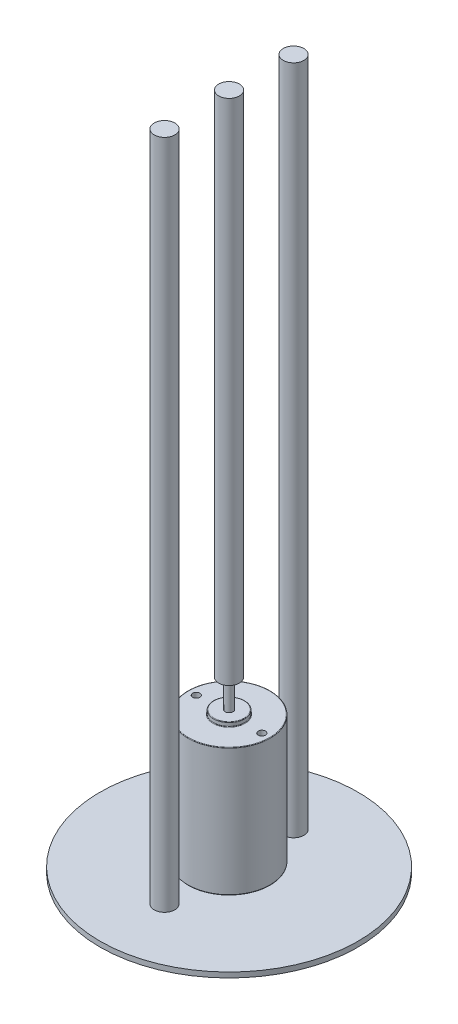
ISO-10303-21;
HEADER;
FILE_DESCRIPTION(('STEP AP214'),'2;1');
FILE_NAME('part.step','',(''),(''),'','','');
FILE_SCHEMA(('AUTOMOTIVE_DESIGN { 1 0 10303 214 1 1 1 1 }'));
ENDSEC;
DATA;
#1=APPLICATION_CONTEXT('core data for automotive mechanical design processes');
#2=APPLICATION_PROTOCOL_DEFINITION('international standard','automotive_design',2000,#1);
#3=PRODUCT_CONTEXT('',#1,'mechanical');
#4=PRODUCT('Part','Part','',(#3));
#5=PRODUCT_RELATED_PRODUCT_CATEGORY('part','',(#4));
#6=PRODUCT_DEFINITION_FORMATION('','',#4);
#7=PRODUCT_DEFINITION_CONTEXT('part definition',#1,'design');
#8=PRODUCT_DEFINITION('design','',#6,#7);
#9=PRODUCT_DEFINITION_SHAPE('','',#8);
#10=(LENGTH_UNIT() NAMED_UNIT(*) SI_UNIT(.MILLI.,.METRE.));
#11=(NAMED_UNIT(*) PLANE_ANGLE_UNIT() SI_UNIT($,.RADIAN.));
#12=(NAMED_UNIT(*) SI_UNIT($,.STERADIAN.) SOLID_ANGLE_UNIT());
#13=UNCERTAINTY_MEASURE_WITH_UNIT(LENGTH_MEASURE(1.E-05),#10,'distance_accuracy_value','');
#14=(GEOMETRIC_REPRESENTATION_CONTEXT(3) GLOBAL_UNCERTAINTY_ASSIGNED_CONTEXT((#13)) GLOBAL_UNIT_ASSIGNED_CONTEXT((#10,
#11,#12)) REPRESENTATION_CONTEXT('',''));
#15=CARTESIAN_POINT('',(0.,0.,0.));
#16=DIRECTION('',(0.,0.,1.));
#17=DIRECTION('',(1.,0.,0.));
#18=AXIS2_PLACEMENT_3D('',#15,#16,#17);
#19=CARTESIAN_POINT('',(7.65544347131464,54.75,-0.0321356612867849));
#20=DIRECTION('',(0.,1.,0.));
#21=DIRECTION('',(1.,0.,0.));
#22=AXIS2_PLACEMENT_3D('',#19,#20,#21);
#23=PLANE('',#22);
#24=CARTESIAN_POINT('',(6.10544347131459,54.75,-0.0321356612867849));
#25=DIRECTION('',(0.,1.,0.));
#26=DIRECTION('',(1.,0.,0.));
#27=AXIS2_PLACEMENT_3D('',#24,#25,#26);
#28=CIRCLE('',#27,5.815);
#29=CARTESIAN_POINT('',(11.9204434713146,54.75,-0.0321356612867849));
#30=VERTEX_POINT('',#29);
#31=EDGE_CURVE('E10',#30,#30,#28,.T.);
#32=ORIENTED_EDGE('',*,*,#31,.T.);
#33=EDGE_LOOP('',(#32));
#34=FACE_BOUND('',#33,.T.);
#35=CARTESIAN_POINT('',(6.10544347131459,54.75,-0.0321356612867849));
#36=DIRECTION('',(0.,1.,0.));
#37=DIRECTION('',(1.,0.,0.));
#38=AXIS2_PLACEMENT_3D('',#35,#36,#37);
#39=CIRCLE('',#38,1.555);
#40=CARTESIAN_POINT('',(7.66044347131459,54.75,-0.0321356612867849));
#41=VERTEX_POINT('',#40);
#42=EDGE_CURVE('E80',#41,#41,#39,.F.);
#43=ORIENTED_EDGE('',*,*,#42,.T.);
#44=EDGE_LOOP('',(#43));
#45=FACE_BOUND('',#44,.T.);
#46=ADVANCED_FACE('F34',(#34,#45),#23,.T.);
#47=CARTESIAN_POINT('',(6.10544347131459,28.375,-0.0321356612867883));
#48=DIRECTION('',(0.,1.,0.));
#49=DIRECTION('',(1.,0.,0.));
#50=AXIS2_PLACEMENT_3D('',#47,#48,#49);
#51=CYLINDRICAL_SURFACE('',#50,6.015);
#52=CARTESIAN_POINT('',(6.10544347131459,3.4,-0.0321356612867918));
#53=DIRECTION('',(0.,-1.,0.));
#54=DIRECTION('',(-1.,0.,0.));
#55=AXIS2_PLACEMENT_3D('',#52,#53,#54);
#56=CIRCLE('',#55,6.015);
#57=CARTESIAN_POINT('',(0.0904434713145871,3.4,-0.0321356612867918));
#58=VERTEX_POINT('',#57);
#59=EDGE_CURVE('E61',#58,#58,#56,.T.);
#60=ORIENTED_EDGE('',*,*,#59,.T.);
#61=EDGE_LOOP('',(#60));
#62=FACE_BOUND('',#61,.T.);
#63=CARTESIAN_POINT('',(6.10544347131459,2.20000000000001,-0.0321356612867918));
#64=DIRECTION('',(0.,-1.,0.));
#65=DIRECTION('',(-1.,0.,0.));
#66=AXIS2_PLACEMENT_3D('',#63,#64,#65);
#67=CIRCLE('',#66,6.015);
#68=CARTESIAN_POINT('',(0.0904434713145871,2.20000000000001,-0.0321356612867918));
#69=VERTEX_POINT('',#68);
#70=EDGE_CURVE('E64',#69,#69,#67,.F.);
#71=ORIENTED_EDGE('',*,*,#70,.T.);
#72=EDGE_LOOP('',(#71));
#73=FACE_BOUND('',#72,.T.);
#74=ADVANCED_FACE('F163',(#62,#73),#51,.T.);
#75=CARTESIAN_POINT('',(12.1204434713146,3.6,-0.0321356612867918));
#76=DIRECTION('',(0.,-1.,0.));
#77=DIRECTION('',(-1.,0.,0.));
#78=AXIS2_PLACEMENT_3D('',#75,#76,#77);
#79=PLANE('',#78);
#80=CARTESIAN_POINT('',(6.10544347131459,3.6,-0.0321356612867918));
#81=DIRECTION('',(0.,-1.,0.));
#82=DIRECTION('',(-1.,0.,0.));
#83=AXIS2_PLACEMENT_3D('',#80,#81,#82);
#84=CIRCLE('',#83,15.675);
#85=CARTESIAN_POINT('',(-9.56955652868541,3.6,-0.0321356612867918));
#86=VERTEX_POINT('',#85);
#87=EDGE_CURVE('E67',#86,#86,#84,.T.);
#88=ORIENTED_EDGE('',*,*,#87,.T.);
#89=EDGE_LOOP('',(#88));
#90=FACE_BOUND('',#89,.T.);
#91=CARTESIAN_POINT('',(6.10544347131459,3.6,-0.0321356612867918));
#92=DIRECTION('',(0.,-1.,0.));
#93=DIRECTION('',(-1.,0.,0.));
#94=AXIS2_PLACEMENT_3D('',#91,#92,#93);
#95=CIRCLE('',#94,6.215);
#96=CARTESIAN_POINT('',(-0.109556528685413,3.6,-0.0321356612867918));
#97=VERTEX_POINT('',#96);
#98=EDGE_CURVE('E70',#97,#97,#95,.F.);
#99=ORIENTED_EDGE('',*,*,#98,.T.);
#100=EDGE_LOOP('',(#99));
#101=FACE_BOUND('',#100,.T.);
#102=ADVANCED_FACE('F168',(#90,#101),#79,.T.);
#103=CARTESIAN_POINT('',(6.10544347131459,28.375,-0.0321356612867883));
#104=DIRECTION('',(0.,1.,0.));
#105=DIRECTION('',(1.,0.,0.));
#106=AXIS2_PLACEMENT_3D('',#103,#104,#105);
#107=CYLINDRICAL_SURFACE('',#106,15.875);
#108=CARTESIAN_POINT('',(6.10544347131459,3.8,-0.0321356612867918));
#109=DIRECTION('',(0.,-1.,0.));
#110=DIRECTION('',(-1.,0.,0.));
#111=AXIS2_PLACEMENT_3D('',#108,#109,#110);
#112=CIRCLE('',#111,15.875);
#113=CARTESIAN_POINT('',(-9.76955652868541,3.8,-0.0321356612867918));
#114=VERTEX_POINT('',#113);
#115=EDGE_CURVE('E73',#114,#114,#112,.F.);
#116=ORIENTED_EDGE('',*,*,#115,.T.);
#117=EDGE_LOOP('',(#116));
#118=FACE_BOUND('',#117,.T.);
#119=CARTESIAN_POINT('',(6.10544347131459,52.95,-0.0321356612867883));
#120=DIRECTION('',(0.,1.,0.));
#121=DIRECTION('',(1.,0.,0.));
#122=AXIS2_PLACEMENT_3D('',#119,#120,#121);
#123=CIRCLE('',#122,15.875);
#124=CARTESIAN_POINT('',(21.9804434713146,52.95,-0.0321356612867883));
#125=VERTEX_POINT('',#124);
#126=EDGE_CURVE('E76',#125,#125,#123,.F.);
#127=ORIENTED_EDGE('',*,*,#126,.T.);
#128=EDGE_LOOP('',(#127));
#129=FACE_BOUND('',#128,.T.);
#130=ADVANCED_FACE('F183',(#118,#129),#107,.T.);
#131=CARTESIAN_POINT('',(12.1204434713146,53.15,-0.0321356612867883));
#132=DIRECTION('',(0.,1.,0.));
#133=DIRECTION('',(1.,0.,0.));
#134=AXIS2_PLACEMENT_3D('',#131,#132,#133);
#135=PLANE('',#134);
#136=CARTESIAN_POINT('',(18.8054434713146,53.15,-0.0321356612867883));
#137=DIRECTION('',(0.,1.,0.));
#138=DIRECTION('',(1.,0.,0.));
#139=AXIS2_PLACEMENT_3D('',#136,#137,#138);
#140=CIRCLE('',#139,1.4);
#141=CARTESIAN_POINT('',(20.2054434713146,53.15,-0.0321356612867883));
#142=VERTEX_POINT('',#141);
#143=EDGE_CURVE('E98',#142,#142,#140,.T.);
#144=ORIENTED_EDGE('',*,*,#143,.F.);
#145=EDGE_LOOP('',(#144));
#146=FACE_BOUND('',#145,.T.);
#147=CARTESIAN_POINT('',(-6.5945565286854,53.15,-0.0321356612867883));
#148=DIRECTION('',(0.,1.,0.));
#149=DIRECTION('',(1.,0.,0.));
#150=AXIS2_PLACEMENT_3D('',#147,#148,#149);
#151=CIRCLE('',#150,1.4);
#152=CARTESIAN_POINT('',(-5.1945565286854,53.15,-0.0321356612867883));
#153=VERTEX_POINT('',#152);
#154=EDGE_CURVE('E92',#153,#153,#151,.T.);
#155=ORIENTED_EDGE('',*,*,#154,.F.);
#156=EDGE_LOOP('',(#155));
#157=FACE_BOUND('',#156,.T.);
#158=CARTESIAN_POINT('',(6.10544347131459,53.15,-0.0321356612867883));
#159=DIRECTION('',(0.,1.,0.));
#160=DIRECTION('',(1.,0.,0.));
#161=AXIS2_PLACEMENT_3D('',#158,#159,#160);
#162=CIRCLE('',#161,15.675);
#163=CARTESIAN_POINT('',(21.7804434713146,53.15,-0.0321356612867883));
#164=VERTEX_POINT('',#163);
#165=EDGE_CURVE('E50',#164,#164,#162,.T.);
#166=ORIENTED_EDGE('',*,*,#165,.T.);
#167=EDGE_LOOP('',(#166));
#168=FACE_BOUND('',#167,.T.);
#169=CARTESIAN_POINT('',(6.10544347131459,53.15,-0.0321356612867883));
#170=DIRECTION('',(0.,1.,0.));
#171=DIRECTION('',(1.,0.,0.));
#172=AXIS2_PLACEMENT_3D('',#169,#170,#171);
#173=CIRCLE('',#172,6.215);
#174=CARTESIAN_POINT('',(12.3204434713146,53.15,-0.0321356612867883));
#175=VERTEX_POINT('',#174);
#176=EDGE_CURVE('E55',#175,#175,#173,.F.);
#177=ORIENTED_EDGE('',*,*,#176,.T.);
#178=EDGE_LOOP('',(#177));
#179=FACE_BOUND('',#178,.T.);
#180=ADVANCED_FACE('F180',(#146,#157,#168,#179),#135,.T.);
#181=CARTESIAN_POINT('',(6.10544347131459,28.375,-0.0321356612867883));
#182=DIRECTION('',(0.,1.,0.));
#183=DIRECTION('',(1.,0.,0.));
#184=AXIS2_PLACEMENT_3D('',#181,#182,#183);
#185=CYLINDRICAL_SURFACE('',#184,6.015);
#186=CARTESIAN_POINT('',(6.10544347131459,53.35,-0.0321356612867883));
#187=DIRECTION('',(0.,1.,0.));
#188=DIRECTION('',(1.,0.,0.));
#189=AXIS2_PLACEMENT_3D('',#186,#187,#188);
#190=CIRCLE('',#189,6.015);
#191=CARTESIAN_POINT('',(12.1204434713146,53.35,-0.0321356612867883));
#192=VERTEX_POINT('',#191);
#193=EDGE_CURVE('E42',#192,#192,#190,.T.);
#194=ORIENTED_EDGE('',*,*,#193,.T.);
#195=EDGE_LOOP('',(#194));
#196=FACE_BOUND('',#195,.T.);
#197=CARTESIAN_POINT('',(6.10544347131459,54.55,-0.0321356612867849));
#198=DIRECTION('',(0.,1.,0.));
#199=DIRECTION('',(1.,0.,0.));
#200=AXIS2_PLACEMENT_3D('',#197,#198,#199);
#201=CIRCLE('',#200,6.015);
#202=CARTESIAN_POINT('',(12.1204434713146,54.55,-0.0321356612867849));
#203=VERTEX_POINT('',#202);
#204=EDGE_CURVE('E46',#203,#203,#201,.F.);
#205=ORIENTED_EDGE('',*,*,#204,.T.);
#206=EDGE_LOOP('',(#205));
#207=FACE_BOUND('',#206,.T.);
#208=ADVANCED_FACE('F176',(#196,#207),#185,.T.);
#209=CARTESIAN_POINT('',(6.10544347131459,65.575,-0.0321356612867849));
#210=DIRECTION('',(0.,-1.,0.));
#211=DIRECTION('',(-1.,0.,0.));
#212=AXIS2_PLACEMENT_3D('',#209,#210,#211);
#213=CYLINDRICAL_SURFACE('',#212,1.555);
#214=ORIENTED_EDGE('',*,*,#42,.F.);
#215=EDGE_LOOP('',(#214));
#216=FACE_BOUND('',#215,.T.);
#217=CARTESIAN_POINT('',(6.10544347131459,65.575,-0.0321356612867849));
#218=DIRECTION('',(0.,1.,0.));
#219=DIRECTION('',(1.,0.,0.));
#220=AXIS2_PLACEMENT_3D('',#217,#218,#219);
#221=CIRCLE('',#220,1.555);
#222=CARTESIAN_POINT('',(7.66044347131459,65.575,-0.0321356612867849));
#223=VERTEX_POINT('',#222);
#224=EDGE_CURVE('E86',#223,#223,#221,.T.);
#225=ORIENTED_EDGE('',*,*,#224,.F.);
#226=EDGE_LOOP('',(#225));
#227=FACE_BOUND('',#226,.T.);
#228=ADVANCED_FACE('F179',(#216,#227),#213,.T.);
#229=CARTESIAN_POINT('',(6.10544347131459,3.8,-0.0321356612867918));
#230=DIRECTION('',(0.,-1.,0.));
#231=DIRECTION('',(-1.,0.,0.));
#232=AXIS2_PLACEMENT_3D('',#229,#230,#231);
#233=TOROIDAL_SURFACE('',#232,15.675,0.2);
#234=ORIENTED_EDGE('',*,*,#87,.F.);
#235=EDGE_LOOP('',(#234));
#236=FACE_BOUND('',#235,.T.);
#237=ORIENTED_EDGE('',*,*,#115,.F.);
#238=EDGE_LOOP('',(#237));
#239=FACE_BOUND('',#238,.T.);
#240=ADVANCED_FACE('F191',(#236,#239),#233,.T.);
#241=CARTESIAN_POINT('',(6.10544347131459,3.4,-0.0321356612867918));
#242=DIRECTION('',(0.,-1.,0.));
#243=DIRECTION('',(-1.,0.,0.));
#244=AXIS2_PLACEMENT_3D('',#241,#242,#243);
#245=TOROIDAL_SURFACE('',#244,6.215,0.2);
#246=ORIENTED_EDGE('',*,*,#59,.F.);
#247=EDGE_LOOP('',(#246));
#248=FACE_BOUND('',#247,.T.);
#249=ORIENTED_EDGE('',*,*,#98,.F.);
#250=EDGE_LOOP('',(#249));
#251=FACE_BOUND('',#250,.T.);
#252=ADVANCED_FACE('F194',(#248,#251),#245,.F.);
#253=CARTESIAN_POINT('',(6.10544347131459,2.20000000000001,-0.0321356612867918));
#254=DIRECTION('',(0.,-1.,0.));
#255=DIRECTION('',(-1.,0.,0.));
#256=AXIS2_PLACEMENT_3D('',#253,#254,#255);
#257=TOROIDAL_SURFACE('',#256,5.815,0.2);
#258=CARTESIAN_POINT('',(6.10544347131459,2.,-0.0321356612867918));
#259=DIRECTION('',(0.,-1.,0.));
#260=DIRECTION('',(-1.,0.,0.));
#261=AXIS2_PLACEMENT_3D('',#258,#259,#260);
#262=CIRCLE('',#261,5.815);
#263=CARTESIAN_POINT('',(0.290443471314587,2.,-0.0321356612867918));
#264=VERTEX_POINT('',#263);
#265=EDGE_CURVE('E58',#264,#264,#262,.T.);
#266=ORIENTED_EDGE('',*,*,#265,.F.);
#267=EDGE_LOOP('',(#266));
#268=FACE_BOUND('',#267,.T.);
#269=ORIENTED_EDGE('',*,*,#70,.F.);
#270=EDGE_LOOP('',(#269));
#271=FACE_BOUND('',#270,.T.);
#272=ADVANCED_FACE('F198',(#268,#271),#257,.T.);
#273=CARTESIAN_POINT('',(6.10544347131459,52.95,-0.0321356612867883));
#274=DIRECTION('',(0.,1.,0.));
#275=DIRECTION('',(1.,0.,0.));
#276=AXIS2_PLACEMENT_3D('',#273,#274,#275);
#277=TOROIDAL_SURFACE('',#276,15.675,0.2);
#278=ORIENTED_EDGE('',*,*,#126,.F.);
#279=EDGE_LOOP('',(#278));
#280=FACE_BOUND('',#279,.T.);
#281=ORIENTED_EDGE('',*,*,#165,.F.);
#282=EDGE_LOOP('',(#281));
#283=FACE_BOUND('',#282,.T.);
#284=ADVANCED_FACE('F202',(#280,#283),#277,.T.);
#285=CARTESIAN_POINT('',(6.10544347131459,53.35,-0.0321356612867883));
#286=DIRECTION('',(0.,1.,0.));
#287=DIRECTION('',(1.,0.,0.));
#288=AXIS2_PLACEMENT_3D('',#285,#286,#287);
#289=TOROIDAL_SURFACE('',#288,6.215,0.2);
#290=ORIENTED_EDGE('',*,*,#176,.F.);
#291=EDGE_LOOP('',(#290));
#292=FACE_BOUND('',#291,.T.);
#293=ORIENTED_EDGE('',*,*,#193,.F.);
#294=EDGE_LOOP('',(#293));
#295=FACE_BOUND('',#294,.T.);
#296=ADVANCED_FACE('F205',(#292,#295),#289,.F.);
#297=CARTESIAN_POINT('',(6.10544347131459,54.55,-0.0321356612867849));
#298=DIRECTION('',(0.,1.,0.));
#299=DIRECTION('',(1.,0.,0.));
#300=AXIS2_PLACEMENT_3D('',#297,#298,#299);
#301=TOROIDAL_SURFACE('',#300,5.815,0.2);
#302=ORIENTED_EDGE('',*,*,#204,.F.);
#303=EDGE_LOOP('',(#302));
#304=FACE_BOUND('',#303,.T.);
#305=ORIENTED_EDGE('',*,*,#31,.F.);
#306=EDGE_LOOP('',(#305));
#307=FACE_BOUND('',#306,.T.);
#308=ADVANCED_FACE('F36',(#304,#307),#301,.T.);
#309=CARTESIAN_POINT('',(-6.5945565286854,48.15,-0.0321356612867883));
#310=DIRECTION('',(0.,1.,0.));
#311=DIRECTION('',(1.,0.,0.));
#312=AXIS2_PLACEMENT_3D('',#309,#310,#311);
#313=CYLINDRICAL_SURFACE('',#312,1.4);
#314=CARTESIAN_POINT('',(-6.5945565286854,48.15,-0.0321356612867883));
#315=DIRECTION('',(0.,1.,0.));
#316=DIRECTION('',(1.,0.,0.));
#317=AXIS2_PLACEMENT_3D('',#314,#315,#316);
#318=CIRCLE('',#317,1.4);
#319=CARTESIAN_POINT('',(-5.1945565286854,48.15,-0.0321356612867883));
#320=VERTEX_POINT('',#319);
#321=EDGE_CURVE('E91',#320,#320,#318,.T.);
#322=ORIENTED_EDGE('',*,*,#321,.F.);
#323=EDGE_LOOP('',(#322));
#324=FACE_BOUND('',#323,.T.);
#325=ORIENTED_EDGE('',*,*,#154,.T.);
#326=EDGE_LOOP('',(#325));
#327=FACE_BOUND('',#326,.T.);
#328=ADVANCED_FACE('F212',(#324,#327),#313,.F.);
#329=CARTESIAN_POINT('',(-6.5945565286854,48.15,-0.0321356612867883));
#330=DIRECTION('',(0.,1.,0.));
#331=DIRECTION('',(1.,0.,0.));
#332=AXIS2_PLACEMENT_3D('',#329,#330,#331);
#333=PLANE('',#332);
#334=ORIENTED_EDGE('',*,*,#321,.T.);
#335=EDGE_LOOP('',(#334));
#336=FACE_BOUND('',#335,.T.);
#337=ADVANCED_FACE('F220',(#336),#333,.T.);
#338=CARTESIAN_POINT('',(18.8054434713146,48.15,-0.0321356612867883));
#339=DIRECTION('',(0.,1.,0.));
#340=DIRECTION('',(1.,0.,0.));
#341=AXIS2_PLACEMENT_3D('',#338,#339,#340);
#342=CYLINDRICAL_SURFACE('',#341,1.4);
#343=CARTESIAN_POINT('',(18.8054434713146,48.15,-0.0321356612867883));
#344=DIRECTION('',(0.,1.,0.));
#345=DIRECTION('',(1.,0.,0.));
#346=AXIS2_PLACEMENT_3D('',#343,#344,#345);
#347=CIRCLE('',#346,1.4);
#348=CARTESIAN_POINT('',(20.2054434713146,48.15,-0.0321356612867883));
#349=VERTEX_POINT('',#348);
#350=EDGE_CURVE('E95',#349,#349,#347,.T.);
#351=ORIENTED_EDGE('',*,*,#350,.F.);
#352=EDGE_LOOP('',(#351));
#353=FACE_BOUND('',#352,.T.);
#354=ORIENTED_EDGE('',*,*,#143,.T.);
#355=EDGE_LOOP('',(#354));
#356=FACE_BOUND('',#355,.T.);
#357=ADVANCED_FACE('F229',(#353,#356),#342,.F.);
#358=CARTESIAN_POINT('',(18.8054434713146,48.15,-0.0321356612867883));
#359=DIRECTION('',(0.,1.,0.));
#360=DIRECTION('',(1.,0.,0.));
#361=AXIS2_PLACEMENT_3D('',#358,#359,#360);
#362=PLANE('',#361);
#363=ORIENTED_EDGE('',*,*,#350,.T.);
#364=EDGE_LOOP('',(#363));
#365=FACE_BOUND('',#364,.T.);
#366=ADVANCED_FACE('F257',(#365),#362,.T.);
#367=CARTESIAN_POINT('',(6.10544347131459,262.575,-0.0321356612867838));
#368=DIRECTION('',(0.,-1.,0.));
#369=DIRECTION('',(0.,0.,-1.));
#370=AXIS2_PLACEMENT_3D('',#367,#368,#369);
#371=CYLINDRICAL_SURFACE('',#370,4.);
#372=CARTESIAN_POINT('',(6.10544347131459,262.575,-0.0321356612867838));
#373=DIRECTION('',(0.,1.,0.));
#374=DIRECTION('',(0.,0.,1.));
#375=AXIS2_PLACEMENT_3D('',#372,#373,#374);
#376=CIRCLE('',#375,4.);
#377=CARTESIAN_POINT('',(6.10544347131459,262.575,3.96786433871322));
#378=VERTEX_POINT('',#377);
#379=EDGE_CURVE('E101',#378,#378,#376,.T.);
#380=ORIENTED_EDGE('',*,*,#379,.F.);
#381=EDGE_LOOP('',(#380));
#382=FACE_BOUND('',#381,.T.);
#383=CARTESIAN_POINT('',(6.10544347131459,65.575,-0.0321356612867838));
#384=DIRECTION('',(0.,1.,0.));
#385=DIRECTION('',(0.,0.,1.));
#386=AXIS2_PLACEMENT_3D('',#383,#384,#385);
#387=CIRCLE('',#386,4.);
#388=CARTESIAN_POINT('',(6.10544347131459,65.575,3.96786433871322));
#389=VERTEX_POINT('',#388);
#390=EDGE_CURVE('E104',#389,#389,#387,.T.);
#391=ORIENTED_EDGE('',*,*,#390,.T.);
#392=EDGE_LOOP('',(#391));
#393=FACE_BOUND('',#392,.T.);
#394=ADVANCED_FACE('F255',(#382,#393),#371,.T.);
#395=CARTESIAN_POINT('',(6.10544347131459,262.575,-0.0321356612867838));
#396=DIRECTION('',(0.,1.,0.));
#397=DIRECTION('',(0.,0.,1.));
#398=AXIS2_PLACEMENT_3D('',#395,#396,#397);
#399=PLANE('',#398);
#400=ORIENTED_EDGE('',*,*,#379,.T.);
#401=EDGE_LOOP('',(#400));
#402=FACE_BOUND('',#401,.T.);
#403=ADVANCED_FACE('F251',(#402),#399,.T.);
#404=CARTESIAN_POINT('',(6.10544347131459,65.575,-0.0321356612867838));
#405=DIRECTION('',(0.,1.,0.));
#406=DIRECTION('',(0.,0.,1.));
#407=AXIS2_PLACEMENT_3D('',#404,#405,#406);
#408=PLANE('',#407);
#409=ORIENTED_EDGE('',*,*,#224,.T.);
#410=EDGE_LOOP('',(#409));
#411=FACE_BOUND('',#410,.T.);
#412=ORIENTED_EDGE('',*,*,#390,.F.);
#413=EDGE_LOOP('',(#412));
#414=FACE_BOUND('',#413,.T.);
#415=ADVANCED_FACE('F248',(#411,#414),#408,.F.);
#416=CARTESIAN_POINT('',(6.10544347131463,262.,24.9678643387132));
#417=DIRECTION('',(0.,1.,0.));
#418=DIRECTION('',(0.,0.,1.));
#419=AXIS2_PLACEMENT_3D('',#416,#417,#418);
#420=PLANE('',#419);
#421=CARTESIAN_POINT('',(6.10544347131463,262.,24.9678643387132));
#422=DIRECTION('',(0.,1.,0.));
#423=DIRECTION('',(0.,0.,1.));
#424=AXIS2_PLACEMENT_3D('',#421,#422,#423);
#425=CIRCLE('',#424,4.);
#426=CARTESIAN_POINT('',(6.10544347131463,262.,28.9678643387132));
#427=VERTEX_POINT('',#426);
#428=EDGE_CURVE('E119',#427,#427,#425,.T.);
#429=ORIENTED_EDGE('',*,*,#428,.T.);
#430=EDGE_LOOP('',(#429));
#431=FACE_BOUND('',#430,.T.);
#432=ADVANCED_FACE('F128',(#431),#420,.T.);
#433=CARTESIAN_POINT('',(6.10544347131463,262.,24.9678643387132));
#434=DIRECTION('',(0.,-1.,0.));
#435=DIRECTION('',(0.,0.,-1.));
#436=AXIS2_PLACEMENT_3D('',#433,#434,#435);
#437=CYLINDRICAL_SURFACE('',#436,4.);
#438=ORIENTED_EDGE('',*,*,#428,.F.);
#439=EDGE_LOOP('',(#438));
#440=FACE_BOUND('',#439,.T.);
#441=CARTESIAN_POINT('',(6.10544347131463,2.,24.9678643387132));
#442=DIRECTION('',(0.,1.,0.));
#443=DIRECTION('',(0.,0.,1.));
#444=AXIS2_PLACEMENT_3D('',#441,#442,#443);
#445=CIRCLE('',#444,4.);
#446=CARTESIAN_POINT('',(6.10544347131463,2.,28.9678643387132));
#447=VERTEX_POINT('',#446);
#448=EDGE_CURVE('E122',#447,#447,#445,.T.);
#449=ORIENTED_EDGE('',*,*,#448,.T.);
#450=EDGE_LOOP('',(#449));
#451=FACE_BOUND('',#450,.T.);
#452=ADVANCED_FACE('F130',(#440,#451),#437,.T.);
#453=CARTESIAN_POINT('',(6.10544347131463,262.,-25.0321356612868));
#454=DIRECTION('',(0.,1.,0.));
#455=DIRECTION('',(0.,0.,1.));
#456=AXIS2_PLACEMENT_3D('',#453,#454,#455);
#457=PLANE('',#456);
#458=CARTESIAN_POINT('',(6.10544347131463,262.,-25.0321356612868));
#459=DIRECTION('',(0.,1.,0.));
#460=DIRECTION('',(0.,0.,1.));
#461=AXIS2_PLACEMENT_3D('',#458,#459,#460);
#462=CIRCLE('',#461,4.);
#463=CARTESIAN_POINT('',(6.10544347131463,262.,-21.0321356612868));
#464=VERTEX_POINT('',#463);
#465=EDGE_CURVE('E113',#464,#464,#462,.T.);
#466=ORIENTED_EDGE('',*,*,#465,.T.);
#467=EDGE_LOOP('',(#466));
#468=FACE_BOUND('',#467,.T.);
#469=ADVANCED_FACE('F133',(#468),#457,.T.);
#470=CARTESIAN_POINT('',(6.10544347131463,262.,-25.0321356612868));
#471=DIRECTION('',(0.,-1.,0.));
#472=DIRECTION('',(0.,0.,-1.));
#473=AXIS2_PLACEMENT_3D('',#470,#471,#472);
#474=CYLINDRICAL_SURFACE('',#473,4.);
#475=ORIENTED_EDGE('',*,*,#465,.F.);
#476=EDGE_LOOP('',(#475));
#477=FACE_BOUND('',#476,.T.);
#478=CARTESIAN_POINT('',(6.10544347131463,2.,-25.0321356612868));
#479=DIRECTION('',(0.,1.,0.));
#480=DIRECTION('',(0.,0.,1.));
#481=AXIS2_PLACEMENT_3D('',#478,#479,#480);
#482=CIRCLE('',#481,4.);
#483=CARTESIAN_POINT('',(6.10544347131463,2.,-21.0321356612868));
#484=VERTEX_POINT('',#483);
#485=EDGE_CURVE('E116',#484,#484,#482,.T.);
#486=ORIENTED_EDGE('',*,*,#485,.T.);
#487=EDGE_LOOP('',(#486));
#488=FACE_BOUND('',#487,.T.);
#489=ADVANCED_FACE('F155',(#477,#488),#474,.T.);
#490=CARTESIAN_POINT('',(6.10544347131463,0.,-0.0321356612867918));
#491=DIRECTION('',(0.,1.,0.));
#492=DIRECTION('',(0.,0.,1.));
#493=AXIS2_PLACEMENT_3D('',#490,#491,#492);
#494=PLANE('',#493);
#495=CARTESIAN_POINT('',(6.10544347131463,0.,-0.0321356612867918));
#496=DIRECTION('',(0.,1.,0.));
#497=DIRECTION('',(0.,0.,1.));
#498=AXIS2_PLACEMENT_3D('',#495,#496,#497);
#499=CIRCLE('',#498,50.);
#500=CARTESIAN_POINT('',(6.10544347131463,0.,49.9678643387132));
#501=VERTEX_POINT('',#500);
#502=EDGE_CURVE('E110',#501,#501,#499,.T.);
#503=ORIENTED_EDGE('',*,*,#502,.F.);
#504=EDGE_LOOP('',(#503));
#505=FACE_BOUND('',#504,.T.);
#506=ADVANCED_FACE('F141',(#505),#494,.F.);
#507=CARTESIAN_POINT('',(6.10544347131463,2.,-0.0321356612867918));
#508=DIRECTION('',(0.,1.,0.));
#509=DIRECTION('',(0.,0.,1.));
#510=AXIS2_PLACEMENT_3D('',#507,#508,#509);
#511=PLANE('',#510);
#512=ORIENTED_EDGE('',*,*,#265,.T.);
#513=EDGE_LOOP('',(#512));
#514=FACE_BOUND('',#513,.T.);
#515=ORIENTED_EDGE('',*,*,#448,.F.);
#516=EDGE_LOOP('',(#515));
#517=FACE_BOUND('',#516,.T.);
#518=ORIENTED_EDGE('',*,*,#485,.F.);
#519=EDGE_LOOP('',(#518));
#520=FACE_BOUND('',#519,.T.);
#521=CARTESIAN_POINT('',(6.10544347131463,2.,-0.0321356612867918));
#522=DIRECTION('',(0.,1.,0.));
#523=DIRECTION('',(0.,0.,1.));
#524=AXIS2_PLACEMENT_3D('',#521,#522,#523);
#525=CIRCLE('',#524,50.);
#526=CARTESIAN_POINT('',(6.10544347131463,2.,49.9678643387132));
#527=VERTEX_POINT('',#526);
#528=EDGE_CURVE('E107',#527,#527,#525,.T.);
#529=ORIENTED_EDGE('',*,*,#528,.T.);
#530=EDGE_LOOP('',(#529));
#531=FACE_BOUND('',#530,.T.);
#532=ADVANCED_FACE('F137',(#514,#517,#520,#531),#511,.T.);
#533=CARTESIAN_POINT('',(6.10544347131463,2.,-0.0321356612867918));
#534=DIRECTION('',(0.,-1.,0.));
#535=DIRECTION('',(0.,0.,-1.));
#536=AXIS2_PLACEMENT_3D('',#533,#534,#535);
#537=CYLINDRICAL_SURFACE('',#536,50.);
#538=ORIENTED_EDGE('',*,*,#528,.F.);
#539=EDGE_LOOP('',(#538));
#540=FACE_BOUND('',#539,.T.);
#541=ORIENTED_EDGE('',*,*,#502,.T.);
#542=EDGE_LOOP('',(#541));
#543=FACE_BOUND('',#542,.T.);
#544=ADVANCED_FACE('F140',(#540,#543),#537,.T.);
#545=CLOSED_SHELL('',(#46,#74,#102,#130,#180,#208,#228,#240,#252,#272,#284,#296,#308,#328,#337,
#357,#366,#394,#403,#415,#432,#452,#469,#489,#506,#532,#544));
#546=CARTESIAN_POINT('',(6.10544347131459,2.,-0.0321356612867918));
#547=DIRECTION('',(0.,1.,0.));
#548=DIRECTION('',(1.,0.,0.));
#549=AXIS2_PLACEMENT_3D('',#546,#547,#548);
#550=CIRCLE('',#549,1.55);
#551=CARTESIAN_POINT('',(7.65544347131459,2.,-0.0321356612867918));
#552=VERTEX_POINT('',#551);
#553=EDGE_CURVE('E79',#552,#552,#550,.T.);
#554=ORIENTED_EDGE('',*,*,#553,.T.);
#555=EDGE_LOOP('',(#554));
#556=FACE_BOUND('',#555,.T.);
#557=ADVANCED_FACE('F144',(#556),#511,.T.);
#558=CARTESIAN_POINT('',(6.10544347131459,28.375,-0.0321356612867883));
#559=DIRECTION('',(0.,1.,0.));
#560=DIRECTION('',(1.,0.,0.));
#561=AXIS2_PLACEMENT_3D('',#558,#559,#560);
#562=PLANE('',#561);
#563=CARTESIAN_POINT('',(6.10544347131459,28.375,-0.0321356612867883));
#564=DIRECTION('',(0.,1.,0.));
#565=DIRECTION('',(1.,0.,0.));
#566=AXIS2_PLACEMENT_3D('',#563,#564,#565);
#567=CIRCLE('',#566,1.55);
#568=CARTESIAN_POINT('',(7.65544347131459,28.375,-0.0321356612867883));
#569=VERTEX_POINT('',#568);
#570=EDGE_CURVE('E83',#569,#569,#567,.T.);
#571=ORIENTED_EDGE('',*,*,#570,.F.);
#572=EDGE_LOOP('',(#571));
#573=FACE_BOUND('',#572,.T.);
#574=ADVANCED_FACE('F236',(#573),#562,.F.);
#575=CARTESIAN_POINT('',(6.10544347131459,28.375,-0.0321356612867883));
#576=DIRECTION('',(0.,1.,0.));
#577=DIRECTION('',(1.,0.,0.));
#578=AXIS2_PLACEMENT_3D('',#575,#576,#577);
#579=CYLINDRICAL_SURFACE('',#578,1.55);
#580=ORIENTED_EDGE('',*,*,#553,.F.);
#581=EDGE_LOOP('',(#580));
#582=FACE_BOUND('',#581,.T.);
#583=ORIENTED_EDGE('',*,*,#570,.T.);
#584=EDGE_LOOP('',(#583));
#585=FACE_BOUND('',#584,.T.);
#586=ADVANCED_FACE('F174',(#582,#585),#579,.F.);
#587=CLOSED_SHELL('',(#557,#574,#586));
#588=ORIENTED_CLOSED_SHELL('',*,#587,.T.);
#589=BREP_WITH_VOIDS('B2',#545,(#588));
#590=ADVANCED_BREP_SHAPE_REPRESENTATION('',(#18,#589),#14);
#591=SHAPE_DEFINITION_REPRESENTATION(#9,#590);
ENDSEC;
END-ISO-10303-21;
